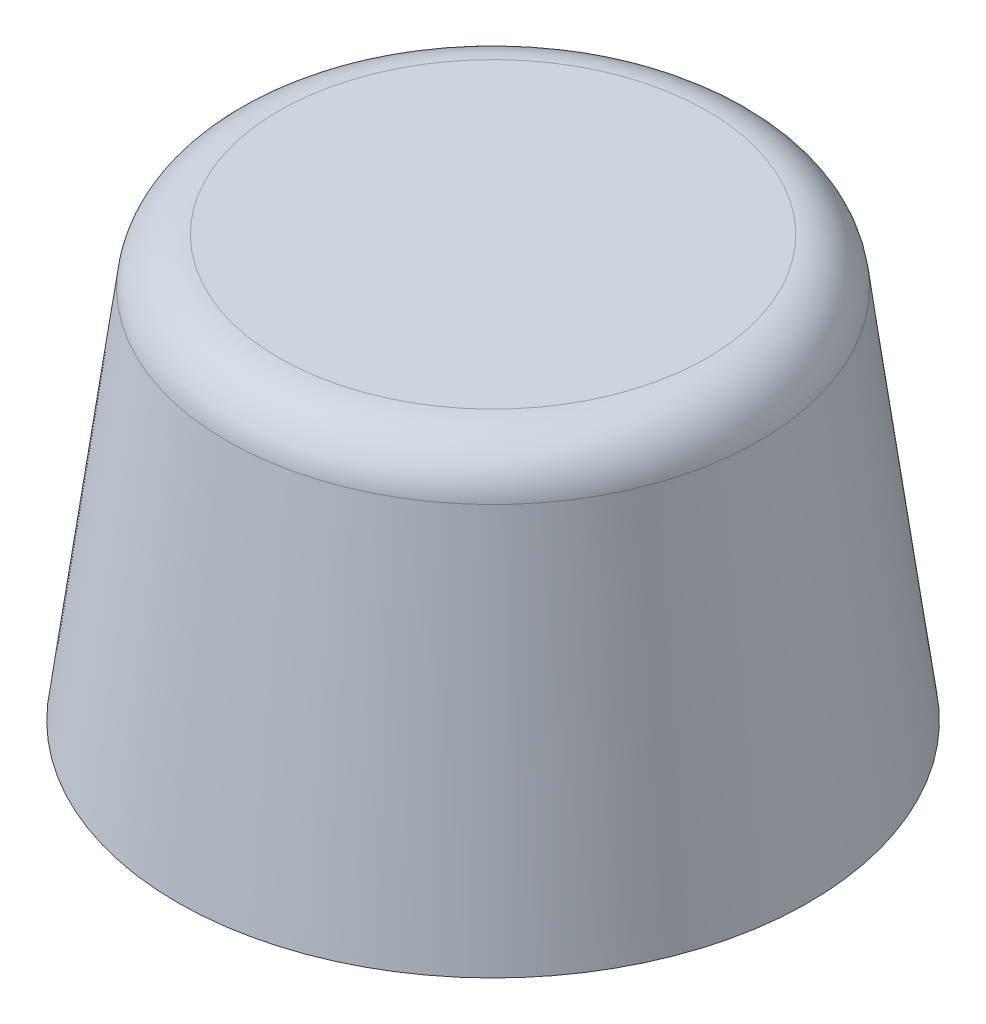
ISO-10303-21;
HEADER;
FILE_DESCRIPTION(('STEP AP214'),'2;1');
FILE_NAME('part.step','',(''),(''),'','','');
FILE_SCHEMA(('AUTOMOTIVE_DESIGN { 1 0 10303 214 1 1 1 1 }'));
ENDSEC;
DATA;
#1=APPLICATION_CONTEXT('core data for automotive mechanical design processes');
#2=APPLICATION_PROTOCOL_DEFINITION('international standard','automotive_design',2000,#1);
#3=PRODUCT_CONTEXT('',#1,'mechanical');
#4=PRODUCT('Part','Part','',(#3));
#5=PRODUCT_RELATED_PRODUCT_CATEGORY('part','',(#4));
#6=PRODUCT_DEFINITION_FORMATION('','',#4);
#7=PRODUCT_DEFINITION_CONTEXT('part definition',#1,'design');
#8=PRODUCT_DEFINITION('design','',#6,#7);
#9=PRODUCT_DEFINITION_SHAPE('','',#8);
#10=(LENGTH_UNIT() NAMED_UNIT(*) SI_UNIT(.MILLI.,.METRE.));
#11=(NAMED_UNIT(*) PLANE_ANGLE_UNIT() SI_UNIT($,.RADIAN.));
#12=(NAMED_UNIT(*) SI_UNIT($,.STERADIAN.) SOLID_ANGLE_UNIT());
#13=UNCERTAINTY_MEASURE_WITH_UNIT(LENGTH_MEASURE(1.E-05),#10,'distance_accuracy_value','');
#14=(GEOMETRIC_REPRESENTATION_CONTEXT(3) GLOBAL_UNCERTAINTY_ASSIGNED_CONTEXT((#13)) GLOBAL_UNIT_ASSIGNED_CONTEXT((#10,
#11,#12)) REPRESENTATION_CONTEXT('',''));
#15=CARTESIAN_POINT('',(0.,0.,0.));
#16=DIRECTION('',(0.,0.,1.));
#17=DIRECTION('',(1.,0.,0.));
#18=AXIS2_PLACEMENT_3D('',#15,#16,#17);
#19=CARTESIAN_POINT('',(-2.85114292872174,9.525,-1.397));
#20=DIRECTION('',(0.,0.,-1.));
#21=DIRECTION('',(-1.,0.,0.));
#22=AXIS2_PLACEMENT_3D('',#19,#20,#21);
#23=PLANE('',#22);
#24=DIRECTION('',(-1.,0.,0.));
#25=VECTOR('',#24,1.);
#26=CARTESIAN_POINT('',(-2.85114292872174,2.54,-1.397));
#27=LINE('',#26,#25);
#28=CARTESIAN_POINT('',(2.85114292872174,2.54,-1.397));
#29=VERTEX_POINT('',#28);
#30=CARTESIAN_POINT('',(-2.85114292872174,2.54,-1.397));
#31=VERTEX_POINT('',#30);
#32=EDGE_CURVE('E64',#29,#31,#27,.T.);
#33=ORIENTED_EDGE('',*,*,#32,.F.);
#34=DIRECTION('',(0.,-1.,0.));
#35=VECTOR('',#34,1.);
#36=CARTESIAN_POINT('',(2.85114292872174,9.525,-1.397));
#37=LINE('',#36,#35);
#38=CARTESIAN_POINT('',(2.85114292872174,9.525,-1.397));
#39=VERTEX_POINT('',#38);
#40=EDGE_CURVE('E58',#39,#29,#37,.T.);
#41=ORIENTED_EDGE('',*,*,#40,.F.);
#42=DIRECTION('',(1.,0.,0.));
#43=VECTOR('',#42,1.);
#44=CARTESIAN_POINT('',(-2.85114292872174,9.525,-1.397));
#45=LINE('',#44,#43);
#46=CARTESIAN_POINT('',(-2.85114292872174,9.525,-1.397));
#47=VERTEX_POINT('',#46);
#48=EDGE_CURVE('E76',#47,#39,#45,.T.);
#49=ORIENTED_EDGE('',*,*,#48,.F.);
#50=DIRECTION('',(0.,-1.,0.));
#51=VECTOR('',#50,1.);
#52=CARTESIAN_POINT('',(-2.85114292872174,9.525,-1.397));
#53=LINE('',#52,#51);
#54=EDGE_CURVE('E71',#47,#31,#53,.T.);
#55=ORIENTED_EDGE('',*,*,#54,.T.);
#56=EDGE_LOOP('',(#33,#41,#49,#55));
#57=FACE_BOUND('',#56,.T.);
#58=ADVANCED_FACE('F37',(#57),#23,.F.);
#59=CARTESIAN_POINT('',(0.,0.,0.));
#60=DIRECTION('',(0.,-1.,0.));
#61=DIRECTION('',(0.,0.,1.));
#62=AXIS2_PLACEMENT_3D('',#59,#60,#61);
#63=CONICAL_SURFACE('',#62,9.525,0.130899693899575);
#64=CARTESIAN_POINT('',(0.,11.3197103301493,0.));
#65=DIRECTION('',(0.,-1.,0.));
#66=DIRECTION('',(0.,0.,-1.));
#67=AXIS2_PLACEMENT_3D('',#64,#65,#66);
#68=CIRCLE('',#67,8.03473186306999);
#69=CARTESIAN_POINT('',(0.,11.3197103301493,-8.03473186306999));
#70=VERTEX_POINT('',#69);
#71=EDGE_CURVE('E11',#70,#70,#68,.T.);
#72=ORIENTED_EDGE('',*,*,#71,.T.);
#73=EDGE_LOOP('',(#72));
#74=FACE_BOUND('',#73,.T.);
#75=CARTESIAN_POINT('',(0.,0.,0.));
#76=DIRECTION('',(0.,1.,0.));
#77=DIRECTION('',(0.,0.,1.));
#78=AXIS2_PLACEMENT_3D('',#75,#76,#77);
#79=CIRCLE('',#78,9.525);
#80=CARTESIAN_POINT('',(0.,0.,9.525));
#81=VERTEX_POINT('',#80);
#82=EDGE_CURVE('E67',#81,#81,#79,.T.);
#83=ORIENTED_EDGE('',*,*,#82,.T.);
#84=EDGE_LOOP('',(#83));
#85=FACE_BOUND('',#84,.T.);
#86=ADVANCED_FACE('F98',(#74,#85),#63,.T.);
#87=CARTESIAN_POINT('',(0.,12.7,0.));
#88=DIRECTION('',(0.,1.,0.));
#89=DIRECTION('',(0.,0.,1.));
#90=AXIS2_PLACEMENT_3D('',#87,#88,#89);
#91=PLANE('',#90);
#92=CARTESIAN_POINT('',(0.,12.7,0.));
#93=DIRECTION('',(0.,1.,0.));
#94=DIRECTION('',(0.,0.,1.));
#95=AXIS2_PLACEMENT_3D('',#92,#93,#94);
#96=CIRCLE('',#95,6.46081314563907);
#97=CARTESIAN_POINT('',(0.,12.7,6.46081314563907));
#98=VERTEX_POINT('',#97);
#99=EDGE_CURVE('E45',#98,#98,#96,.T.);
#100=ORIENTED_EDGE('',*,*,#99,.T.);
#101=EDGE_LOOP('',(#100));
#102=FACE_BOUND('',#101,.T.);
#103=ADVANCED_FACE('F87',(#102),#91,.T.);
#104=CARTESIAN_POINT('',(0.,0.,0.));
#105=DIRECTION('',(0.,1.,0.));
#106=DIRECTION('',(0.,0.,1.));
#107=AXIS2_PLACEMENT_3D('',#104,#105,#106);
#108=PLANE('',#107);
#109=CARTESIAN_POINT('',(0.,0.,0.));
#110=DIRECTION('',(0.,-1.,0.));
#111=DIRECTION('',(0.,0.,-1.));
#112=AXIS2_PLACEMENT_3D('',#109,#110,#111);
#113=CIRCLE('',#112,3.175);
#114=CARTESIAN_POINT('',(0.,0.,-3.175));
#115=VERTEX_POINT('',#114);
#116=EDGE_CURVE('E73',#115,#115,#113,.T.);
#117=ORIENTED_EDGE('',*,*,#116,.F.);
#118=EDGE_LOOP('',(#117));
#119=FACE_BOUND('',#118,.T.);
#120=ORIENTED_EDGE('',*,*,#82,.F.);
#121=EDGE_LOOP('',(#120));
#122=FACE_BOUND('',#121,.T.);
#123=ADVANCED_FACE('F108',(#119,#122),#108,.F.);
#124=CARTESIAN_POINT('',(0.,9.525,0.));
#125=DIRECTION('',(0.,-1.,0.));
#126=DIRECTION('',(0.,0.,-1.));
#127=AXIS2_PLACEMENT_3D('',#124,#125,#126);
#128=CYLINDRICAL_SURFACE('',#127,3.175);
#129=ORIENTED_EDGE('',*,*,#116,.T.);
#130=EDGE_LOOP('',(#129));
#131=FACE_BOUND('',#130,.T.);
#132=CARTESIAN_POINT('',(0.,2.54,0.));
#133=DIRECTION('',(0.,-1.,0.));
#134=DIRECTION('',(0.,0.,-1.));
#135=AXIS2_PLACEMENT_3D('',#132,#133,#134);
#136=CIRCLE('',#135,3.175);
#137=EDGE_CURVE('E51',#31,#29,#136,.T.);
#138=ORIENTED_EDGE('',*,*,#137,.F.);
#139=ORIENTED_EDGE('',*,*,#54,.F.);
#140=CARTESIAN_POINT('',(0.,9.525,0.));
#141=DIRECTION('',(0.,-1.,0.));
#142=DIRECTION('',(0.,0.,-1.));
#143=AXIS2_PLACEMENT_3D('',#140,#141,#142);
#144=CIRCLE('',#143,3.175);
#145=EDGE_CURVE('E79',#39,#47,#144,.T.);
#146=ORIENTED_EDGE('',*,*,#145,.F.);
#147=ORIENTED_EDGE('',*,*,#40,.T.);
#148=EDGE_LOOP('',(#138,#139,#146,#147));
#149=FACE_BOUND('',#148,.T.);
#150=ADVANCED_FACE('F70',(#131,#149),#128,.F.);
#151=CARTESIAN_POINT('',(0.,9.525,0.));
#152=DIRECTION('',(0.,-1.,0.));
#153=DIRECTION('',(0.,0.,-1.));
#154=AXIS2_PLACEMENT_3D('',#151,#152,#153);
#155=PLANE('',#154);
#156=ORIENTED_EDGE('',*,*,#145,.T.);
#157=ORIENTED_EDGE('',*,*,#48,.T.);
#158=EDGE_LOOP('',(#156,#157));
#159=FACE_BOUND('',#158,.T.);
#160=ADVANCED_FACE('F94',(#159),#155,.T.);
#161=CARTESIAN_POINT('',(0.,2.54,0.));
#162=DIRECTION('',(0.,-1.,0.));
#163=DIRECTION('',(0.,0.,-1.));
#164=AXIS2_PLACEMENT_3D('',#161,#162,#163);
#165=PLANE('',#164);
#166=ORIENTED_EDGE('',*,*,#32,.T.);
#167=ORIENTED_EDGE('',*,*,#137,.T.);
#168=EDGE_LOOP('',(#166,#167));
#169=FACE_BOUND('',#168,.T.);
#170=ADVANCED_FACE('F65',(#169),#165,.T.);
#171=CARTESIAN_POINT('',(0.,11.1125,0.));
#172=DIRECTION('',(0.,1.,0.));
#173=DIRECTION('',(0.,0.,1.));
#174=AXIS2_PLACEMENT_3D('',#171,#172,#173);
#175=TOROIDAL_SURFACE('',#174,6.46081314563907,1.5875);
#176=ORIENTED_EDGE('',*,*,#71,.F.);
#177=EDGE_LOOP('',(#176));
#178=FACE_BOUND('',#177,.T.);
#179=ORIENTED_EDGE('',*,*,#99,.F.);
#180=EDGE_LOOP('',(#179));
#181=FACE_BOUND('',#180,.T.);
#182=ADVANCED_FACE('F39',(#178,#181),#175,.T.);
#183=CLOSED_SHELL('',(#58,#86,#103,#123,#150,#160,#170,#182));
#184=MANIFOLD_SOLID_BREP('B2',#183);
#185=ADVANCED_BREP_SHAPE_REPRESENTATION('',(#18,#184),#14);
#186=SHAPE_DEFINITION_REPRESENTATION(#9,#185);
ENDSEC;
END-ISO-10303-21;
